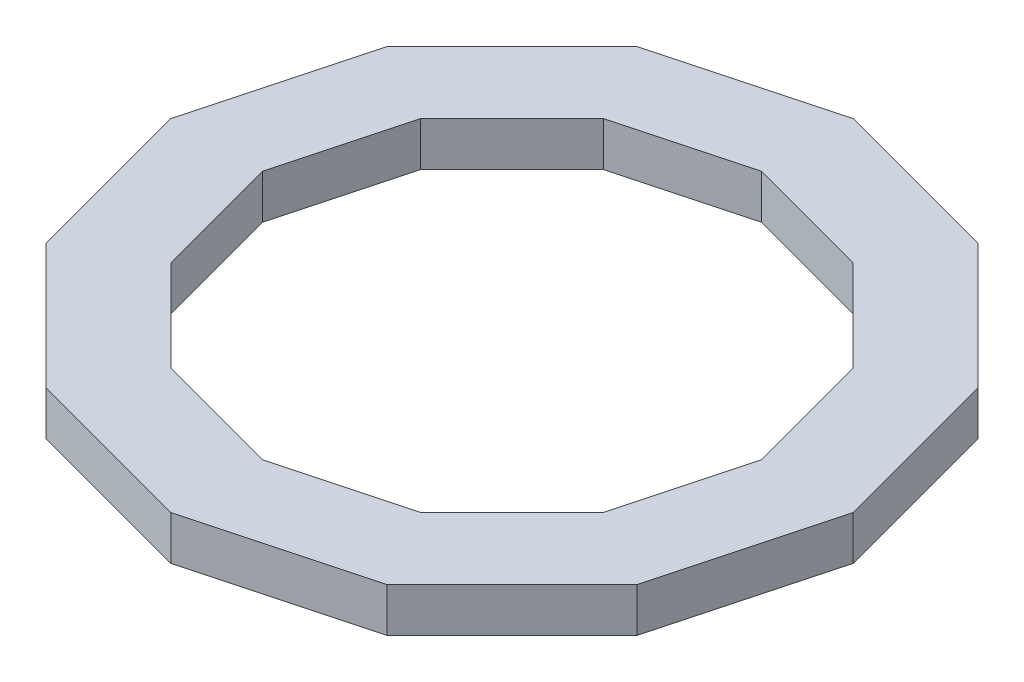
ISO-10303-21;
HEADER;
FILE_DESCRIPTION(('STEP AP214'),'2;1');
FILE_NAME('part.step','',(''),(''),'','','');
FILE_SCHEMA(('AUTOMOTIVE_DESIGN { 1 0 10303 214 1 1 1 1 }'));
ENDSEC;
DATA;
#1=APPLICATION_CONTEXT('core data for automotive mechanical design processes');
#2=APPLICATION_PROTOCOL_DEFINITION('international standard','automotive_design',2000,#1);
#3=PRODUCT_CONTEXT('',#1,'mechanical');
#4=PRODUCT('Part','Part','',(#3));
#5=PRODUCT_RELATED_PRODUCT_CATEGORY('part','',(#4));
#6=PRODUCT_DEFINITION_FORMATION('','',#4);
#7=PRODUCT_DEFINITION_CONTEXT('part definition',#1,'design');
#8=PRODUCT_DEFINITION('design','',#6,#7);
#9=PRODUCT_DEFINITION_SHAPE('','',#8);
#10=(LENGTH_UNIT() NAMED_UNIT(*) SI_UNIT(.MILLI.,.METRE.));
#11=(NAMED_UNIT(*) PLANE_ANGLE_UNIT() SI_UNIT($,.RADIAN.));
#12=(NAMED_UNIT(*) SI_UNIT($,.STERADIAN.) SOLID_ANGLE_UNIT());
#13=UNCERTAINTY_MEASURE_WITH_UNIT(LENGTH_MEASURE(1.E-05),#10,'distance_accuracy_value','');
#14=(GEOMETRIC_REPRESENTATION_CONTEXT(3) GLOBAL_UNCERTAINTY_ASSIGNED_CONTEXT((#13)) GLOBAL_UNIT_ASSIGNED_CONTEXT((#10,
#11,#12)) REPRESENTATION_CONTEXT('',''));
#15=CARTESIAN_POINT('',(0.,0.,0.));
#16=DIRECTION('',(0.,0.,1.));
#17=DIRECTION('',(1.,0.,0.));
#18=AXIS2_PLACEMENT_3D('',#15,#16,#17);
#19=CARTESIAN_POINT('',(0.,19.05,0.));
#20=DIRECTION('',(0.,1.,0.));
#21=DIRECTION('',(0.,0.,1.));
#22=AXIS2_PLACEMENT_3D('',#19,#20,#21);
#23=PLANE('',#22);
#24=DIRECTION('',(-0.258819045102521,0.,0.965925826289068));
#25=VECTOR('',#24,1.);
#26=CARTESIAN_POINT('',(-127.485084689642,19.05,-73.603547963227));
#27=LINE('',#26,#25);
#28=CARTESIAN_POINT('',(-127.485084689642,19.05,-73.603547963227));
#29=VERTEX_POINT('',#28);
#30=CARTESIAN_POINT('',(-147.207095926454,19.05,0.));
#31=VERTEX_POINT('',#30);
#32=EDGE_CURVE('E287',#29,#31,#27,.T.);
#33=ORIENTED_EDGE('',*,*,#32,.T.);
#34=DIRECTION('',(0.258819045102522,0.,0.965925826289068));
#35=VECTOR('',#34,1.);
#36=CARTESIAN_POINT('',(-147.207095926454,19.05,0.));
#37=LINE('',#36,#35);
#38=CARTESIAN_POINT('',(-127.485084689642,19.05,73.603547963227));
#39=VERTEX_POINT('',#38);
#40=EDGE_CURVE('E290',#31,#39,#37,.T.);
#41=ORIENTED_EDGE('',*,*,#40,.T.);
#42=DIRECTION('',(0.707106781186547,0.,0.707106781186548));
#43=VECTOR('',#42,1.);
#44=CARTESIAN_POINT('',(-127.485084689642,19.05,73.603547963227));
#45=LINE('',#44,#43);
#46=CARTESIAN_POINT('',(-73.603547963227,19.05,127.485084689642));
#47=VERTEX_POINT('',#46);
#48=EDGE_CURVE('E293',#39,#47,#45,.T.);
#49=ORIENTED_EDGE('',*,*,#48,.T.);
#50=DIRECTION('',(0.965925826289069,0.,0.25881904510252));
#51=VECTOR('',#50,1.);
#52=CARTESIAN_POINT('',(-73.603547963227,19.05,127.485084689642));
#53=LINE('',#52,#51);
#54=CARTESIAN_POINT('',(0.,19.05,147.207095926454));
#55=VERTEX_POINT('',#54);
#56=EDGE_CURVE('E295',#47,#55,#53,.T.);
#57=ORIENTED_EDGE('',*,*,#56,.T.);
#58=DIRECTION('',(0.965925826289068,0.,-0.258819045102521));
#59=VECTOR('',#58,1.);
#60=CARTESIAN_POINT('',(0.,19.05,147.207095926454));
#61=LINE('',#60,#59);
#62=CARTESIAN_POINT('',(73.603547963227,19.05,127.485084689642));
#63=VERTEX_POINT('',#62);
#64=EDGE_CURVE('E297',#55,#63,#61,.T.);
#65=ORIENTED_EDGE('',*,*,#64,.T.);
#66=DIRECTION('',(0.707106781186547,0.,-0.707106781186548));
#67=VECTOR('',#66,1.);
#68=CARTESIAN_POINT('',(73.603547963227,19.05,127.485084689642));
#69=LINE('',#68,#67);
#70=CARTESIAN_POINT('',(127.485084689642,19.05,73.603547963227));
#71=VERTEX_POINT('',#70);
#72=EDGE_CURVE('E299',#63,#71,#69,.T.);
#73=ORIENTED_EDGE('',*,*,#72,.T.);
#74=DIRECTION('',(0.25881904510252,0.,-0.965925826289068));
#75=VECTOR('',#74,1.);
#76=CARTESIAN_POINT('',(127.485084689642,19.05,73.603547963227));
#77=LINE('',#76,#75);
#78=CARTESIAN_POINT('',(147.207095926454,19.05,0.));
#79=VERTEX_POINT('',#78);
#80=EDGE_CURVE('E301',#71,#79,#77,.T.);
#81=ORIENTED_EDGE('',*,*,#80,.T.);
#82=DIRECTION('',(-0.258819045102521,0.,-0.965925826289068));
#83=VECTOR('',#82,1.);
#84=CARTESIAN_POINT('',(147.207095926454,19.05,0.));
#85=LINE('',#84,#83);
#86=CARTESIAN_POINT('',(127.485084689642,19.05,-73.603547963227));
#87=VERTEX_POINT('',#86);
#88=EDGE_CURVE('E303',#79,#87,#85,.T.);
#89=ORIENTED_EDGE('',*,*,#88,.T.);
#90=DIRECTION('',(-0.707106781186548,0.,-0.707106781186548));
#91=VECTOR('',#90,1.);
#92=CARTESIAN_POINT('',(127.485084689642,19.05,-73.603547963227));
#93=LINE('',#92,#91);
#94=CARTESIAN_POINT('',(73.6035479632268,19.05,-127.485084689642));
#95=VERTEX_POINT('',#94);
#96=EDGE_CURVE('E305',#87,#95,#93,.T.);
#97=ORIENTED_EDGE('',*,*,#96,.T.);
#98=DIRECTION('',(-0.965925826289068,0.,-0.25881904510252));
#99=VECTOR('',#98,1.);
#100=CARTESIAN_POINT('',(73.6035479632268,19.05,-127.485084689642));
#101=LINE('',#100,#99);
#102=CARTESIAN_POINT('',(0.,19.05,-147.207095926454));
#103=VERTEX_POINT('',#102);
#104=EDGE_CURVE('E307',#95,#103,#101,.T.);
#105=ORIENTED_EDGE('',*,*,#104,.T.);
#106=DIRECTION('',(-0.965925826289068,0.,0.258819045102521));
#107=VECTOR('',#106,1.);
#108=CARTESIAN_POINT('',(0.,19.05,-147.207095926454));
#109=LINE('',#108,#107);
#110=CARTESIAN_POINT('',(-73.603547963227,19.05,-127.485084689642));
#111=VERTEX_POINT('',#110);
#112=EDGE_CURVE('E309',#103,#111,#109,.T.);
#113=ORIENTED_EDGE('',*,*,#112,.T.);
#114=DIRECTION('',(-0.707106781186548,0.,0.707106781186548));
#115=VECTOR('',#114,1.);
#116=CARTESIAN_POINT('',(-73.603547963227,19.05,-127.485084689642));
#117=LINE('',#116,#115);
#118=EDGE_CURVE('E311',#111,#29,#117,.T.);
#119=ORIENTED_EDGE('',*,*,#118,.T.);
#120=EDGE_LOOP('',(#33,#41,#49,#57,#65,#73,#81,#89,#97,#105,#113,#119));
#121=FACE_BOUND('',#120,.T.);
#122=DIRECTION('',(0.258819045102521,0.,0.965925826289068));
#123=VECTOR('',#122,1.);
#124=CARTESIAN_POINT('',(-107.76307345283,19.05,0.));
#125=LINE('',#124,#123);
#126=CARTESIAN_POINT('',(-107.76307345283,19.05,0.));
#127=VERTEX_POINT('',#126);
#128=CARTESIAN_POINT('',(-93.325559200039,19.05,53.8815367264149));
#129=VERTEX_POINT('',#128);
#130=EDGE_CURVE('E202',#127,#129,#125,.T.);
#131=ORIENTED_EDGE('',*,*,#130,.F.);
#132=DIRECTION('',(-0.258819045102521,0.,0.965925826289068));
#133=VECTOR('',#132,1.);
#134=CARTESIAN_POINT('',(-93.325559200039,19.05,-53.8815367264149));
#135=LINE('',#134,#133);
#136=CARTESIAN_POINT('',(-93.325559200039,19.05,-53.8815367264149));
#137=VERTEX_POINT('',#136);
#138=EDGE_CURVE('E194',#137,#127,#135,.T.);
#139=ORIENTED_EDGE('',*,*,#138,.F.);
#140=DIRECTION('',(-0.707106781186548,0.,0.707106781186548));
#141=VECTOR('',#140,1.);
#142=CARTESIAN_POINT('',(-53.8815367264149,19.05,-93.325559200039));
#143=LINE('',#142,#141);
#144=CARTESIAN_POINT('',(-53.8815367264149,19.05,-93.325559200039));
#145=VERTEX_POINT('',#144);
#146=EDGE_CURVE('E235',#145,#137,#143,.T.);
#147=ORIENTED_EDGE('',*,*,#146,.F.);
#148=DIRECTION('',(-0.965925826289068,0.,0.258819045102521));
#149=VECTOR('',#148,1.);
#150=CARTESIAN_POINT('',(0.,19.05,-107.76307345283));
#151=LINE('',#150,#149);
#152=CARTESIAN_POINT('',(0.,19.05,-107.76307345283));
#153=VERTEX_POINT('',#152);
#154=EDGE_CURVE('E233',#153,#145,#151,.T.);
#155=ORIENTED_EDGE('',*,*,#154,.F.);
#156=DIRECTION('',(-0.965925826289068,0.,-0.258819045102521));
#157=VECTOR('',#156,1.);
#158=CARTESIAN_POINT('',(53.8815367264149,19.05,-93.325559200039));
#159=LINE('',#158,#157);
#160=CARTESIAN_POINT('',(53.8815367264149,19.05,-93.325559200039));
#161=VERTEX_POINT('',#160);
#162=EDGE_CURVE('E231',#161,#153,#159,.T.);
#163=ORIENTED_EDGE('',*,*,#162,.F.);
#164=DIRECTION('',(-0.707106781186547,0.,-0.707106781186548));
#165=VECTOR('',#164,1.);
#166=CARTESIAN_POINT('',(93.325559200039,19.05,-53.8815367264149));
#167=LINE('',#166,#165);
#168=CARTESIAN_POINT('',(93.325559200039,19.05,-53.8815367264149));
#169=VERTEX_POINT('',#168);
#170=EDGE_CURVE('E229',#169,#161,#167,.T.);
#171=ORIENTED_EDGE('',*,*,#170,.F.);
#172=DIRECTION('',(-0.258819045102521,0.,-0.965925826289068));
#173=VECTOR('',#172,1.);
#174=CARTESIAN_POINT('',(107.76307345283,19.05,0.));
#175=LINE('',#174,#173);
#176=CARTESIAN_POINT('',(107.76307345283,19.05,0.));
#177=VERTEX_POINT('',#176);
#178=EDGE_CURVE('E227',#177,#169,#175,.T.);
#179=ORIENTED_EDGE('',*,*,#178,.F.);
#180=DIRECTION('',(0.258819045102521,0.,-0.965925826289068));
#181=VECTOR('',#180,1.);
#182=CARTESIAN_POINT('',(93.325559200039,19.05,53.8815367264149));
#183=LINE('',#182,#181);
#184=CARTESIAN_POINT('',(93.325559200039,19.05,53.8815367264149));
#185=VERTEX_POINT('',#184);
#186=EDGE_CURVE('E225',#185,#177,#183,.T.);
#187=ORIENTED_EDGE('',*,*,#186,.F.);
#188=DIRECTION('',(0.707106781186547,0.,-0.707106781186548));
#189=VECTOR('',#188,1.);
#190=CARTESIAN_POINT('',(53.8815367264149,19.05,93.325559200039));
#191=LINE('',#190,#189);
#192=CARTESIAN_POINT('',(53.8815367264149,19.05,93.325559200039));
#193=VERTEX_POINT('',#192);
#194=EDGE_CURVE('E223',#193,#185,#191,.T.);
#195=ORIENTED_EDGE('',*,*,#194,.F.);
#196=DIRECTION('',(0.965925826289068,0.,-0.258819045102521));
#197=VECTOR('',#196,1.);
#198=CARTESIAN_POINT('',(0.,19.05,107.76307345283));
#199=LINE('',#198,#197);
#200=CARTESIAN_POINT('',(0.,19.05,107.76307345283));
#201=VERTEX_POINT('',#200);
#202=EDGE_CURVE('E221',#201,#193,#199,.T.);
#203=ORIENTED_EDGE('',*,*,#202,.F.);
#204=DIRECTION('',(0.965925826289068,0.,0.258819045102521));
#205=VECTOR('',#204,1.);
#206=CARTESIAN_POINT('',(-53.8815367264149,19.05,93.325559200039));
#207=LINE('',#206,#205);
#208=CARTESIAN_POINT('',(-53.8815367264149,19.05,93.325559200039));
#209=VERTEX_POINT('',#208);
#210=EDGE_CURVE('E217',#209,#201,#207,.T.);
#211=ORIENTED_EDGE('',*,*,#210,.F.);
#212=DIRECTION('',(0.707106781186548,0.,0.707106781186547));
#213=VECTOR('',#212,1.);
#214=CARTESIAN_POINT('',(-93.325559200039,19.05,53.8815367264149));
#215=LINE('',#214,#213);
#216=EDGE_CURVE('E215',#129,#209,#215,.T.);
#217=ORIENTED_EDGE('',*,*,#216,.F.);
#218=EDGE_LOOP('',(#131,#139,#147,#155,#163,#171,#179,#187,#195,#203,#211,#217));
#219=FACE_BOUND('',#218,.T.);
#220=ADVANCED_FACE('F33',(#121,#219),#23,.T.);
#221=CARTESIAN_POINT('',(0.,0.,0.));
#222=DIRECTION('',(0.,1.,0.));
#223=DIRECTION('',(0.,0.,1.));
#224=AXIS2_PLACEMENT_3D('',#221,#222,#223);
#225=PLANE('',#224);
#226=DIRECTION('',(-0.258819045102521,0.,0.965925826289068));
#227=VECTOR('',#226,1.);
#228=CARTESIAN_POINT('',(-127.485084689642,0.,-73.603547963227));
#229=LINE('',#228,#227);
#230=CARTESIAN_POINT('',(-127.485084689642,0.,-73.603547963227));
#231=VERTEX_POINT('',#230);
#232=CARTESIAN_POINT('',(-147.207095926454,0.,0.));
#233=VERTEX_POINT('',#232);
#234=EDGE_CURVE('E210',#231,#233,#229,.T.);
#235=ORIENTED_EDGE('',*,*,#234,.F.);
#236=DIRECTION('',(-0.707106781186548,0.,0.707106781186548));
#237=VECTOR('',#236,1.);
#238=CARTESIAN_POINT('',(-73.603547963227,0.,-127.485084689642));
#239=LINE('',#238,#237);
#240=CARTESIAN_POINT('',(-73.603547963227,0.,-127.485084689642));
#241=VERTEX_POINT('',#240);
#242=EDGE_CURVE('E291',#241,#231,#239,.T.);
#243=ORIENTED_EDGE('',*,*,#242,.F.);
#244=DIRECTION('',(-0.965925826289068,0.,0.258819045102521));
#245=VECTOR('',#244,1.);
#246=CARTESIAN_POINT('',(0.,0.,-147.207095926454));
#247=LINE('',#246,#245);
#248=CARTESIAN_POINT('',(0.,0.,-147.207095926454));
#249=VERTEX_POINT('',#248);
#250=EDGE_CURVE('E334',#249,#241,#247,.T.);
#251=ORIENTED_EDGE('',*,*,#250,.F.);
#252=DIRECTION('',(-0.965925826289068,0.,-0.25881904510252));
#253=VECTOR('',#252,1.);
#254=CARTESIAN_POINT('',(73.6035479632268,0.,-127.485084689642));
#255=LINE('',#254,#253);
#256=CARTESIAN_POINT('',(73.6035479632268,0.,-127.485084689642));
#257=VERTEX_POINT('',#256);
#258=EDGE_CURVE('E332',#257,#249,#255,.T.);
#259=ORIENTED_EDGE('',*,*,#258,.F.);
#260=DIRECTION('',(-0.707106781186548,0.,-0.707106781186548));
#261=VECTOR('',#260,1.);
#262=CARTESIAN_POINT('',(127.485084689642,0.,-73.603547963227));
#263=LINE('',#262,#261);
#264=CARTESIAN_POINT('',(127.485084689642,0.,-73.603547963227));
#265=VERTEX_POINT('',#264);
#266=EDGE_CURVE('E330',#265,#257,#263,.T.);
#267=ORIENTED_EDGE('',*,*,#266,.F.);
#268=DIRECTION('',(-0.258819045102521,0.,-0.965925826289068));
#269=VECTOR('',#268,1.);
#270=CARTESIAN_POINT('',(147.207095926454,0.,0.));
#271=LINE('',#270,#269);
#272=CARTESIAN_POINT('',(147.207095926454,0.,0.));
#273=VERTEX_POINT('',#272);
#274=EDGE_CURVE('E328',#273,#265,#271,.T.);
#275=ORIENTED_EDGE('',*,*,#274,.F.);
#276=DIRECTION('',(0.25881904510252,0.,-0.965925826289068));
#277=VECTOR('',#276,1.);
#278=CARTESIAN_POINT('',(127.485084689642,0.,73.603547963227));
#279=LINE('',#278,#277);
#280=CARTESIAN_POINT('',(127.485084689642,0.,73.603547963227));
#281=VERTEX_POINT('',#280);
#282=EDGE_CURVE('E326',#281,#273,#279,.T.);
#283=ORIENTED_EDGE('',*,*,#282,.F.);
#284=DIRECTION('',(0.707106781186547,0.,-0.707106781186548));
#285=VECTOR('',#284,1.);
#286=CARTESIAN_POINT('',(73.603547963227,0.,127.485084689642));
#287=LINE('',#286,#285);
#288=CARTESIAN_POINT('',(73.603547963227,0.,127.485084689642));
#289=VERTEX_POINT('',#288);
#290=EDGE_CURVE('E324',#289,#281,#287,.T.);
#291=ORIENTED_EDGE('',*,*,#290,.F.);
#292=DIRECTION('',(0.965925826289068,0.,-0.258819045102521));
#293=VECTOR('',#292,1.);
#294=CARTESIAN_POINT('',(0.,0.,147.207095926454));
#295=LINE('',#294,#293);
#296=CARTESIAN_POINT('',(0.,0.,147.207095926454));
#297=VERTEX_POINT('',#296);
#298=EDGE_CURVE('E322',#297,#289,#295,.T.);
#299=ORIENTED_EDGE('',*,*,#298,.F.);
#300=DIRECTION('',(0.965925826289069,0.,0.25881904510252));
#301=VECTOR('',#300,1.);
#302=CARTESIAN_POINT('',(-73.603547963227,0.,127.485084689642));
#303=LINE('',#302,#301);
#304=CARTESIAN_POINT('',(-73.603547963227,0.,127.485084689642));
#305=VERTEX_POINT('',#304);
#306=EDGE_CURVE('E320',#305,#297,#303,.T.);
#307=ORIENTED_EDGE('',*,*,#306,.F.);
#308=DIRECTION('',(0.707106781186547,0.,0.707106781186548));
#309=VECTOR('',#308,1.);
#310=CARTESIAN_POINT('',(-127.485084689642,0.,73.603547963227));
#311=LINE('',#310,#309);
#312=CARTESIAN_POINT('',(-127.485084689642,0.,73.603547963227));
#313=VERTEX_POINT('',#312);
#314=EDGE_CURVE('E318',#313,#305,#311,.T.);
#315=ORIENTED_EDGE('',*,*,#314,.F.);
#316=DIRECTION('',(0.258819045102522,0.,0.965925826289068));
#317=VECTOR('',#316,1.);
#318=CARTESIAN_POINT('',(-147.207095926454,0.,0.));
#319=LINE('',#318,#317);
#320=EDGE_CURVE('E316',#233,#313,#319,.T.);
#321=ORIENTED_EDGE('',*,*,#320,.F.);
#322=EDGE_LOOP('',(#235,#243,#251,#259,#267,#275,#283,#291,#299,#307,#315,#321));
#323=FACE_BOUND('',#322,.T.);
#324=DIRECTION('',(-0.258819045102521,0.,0.965925826289068));
#325=VECTOR('',#324,1.);
#326=CARTESIAN_POINT('',(-93.325559200039,0.,-53.8815367264149));
#327=LINE('',#326,#325);
#328=CARTESIAN_POINT('',(-93.325559200039,0.,-53.8815367264149));
#329=VERTEX_POINT('',#328);
#330=CARTESIAN_POINT('',(-107.76307345283,0.,0.));
#331=VERTEX_POINT('',#330);
#332=EDGE_CURVE('E56',#329,#331,#327,.T.);
#333=ORIENTED_EDGE('',*,*,#332,.T.);
#334=DIRECTION('',(0.258819045102521,0.,0.965925826289068));
#335=VECTOR('',#334,1.);
#336=CARTESIAN_POINT('',(-107.76307345283,0.,0.));
#337=LINE('',#336,#335);
#338=CARTESIAN_POINT('',(-93.325559200039,0.,53.8815367264149));
#339=VERTEX_POINT('',#338);
#340=EDGE_CURVE('E209',#331,#339,#337,.T.);
#341=ORIENTED_EDGE('',*,*,#340,.T.);
#342=DIRECTION('',(0.707106781186548,0.,0.707106781186547));
#343=VECTOR('',#342,1.);
#344=CARTESIAN_POINT('',(-93.325559200039,0.,53.8815367264149));
#345=LINE('',#344,#343);
#346=CARTESIAN_POINT('',(-53.8815367264149,0.,93.325559200039));
#347=VERTEX_POINT('',#346);
#348=EDGE_CURVE('E239',#339,#347,#345,.T.);
#349=ORIENTED_EDGE('',*,*,#348,.T.);
#350=DIRECTION('',(0.965925826289068,0.,0.258819045102521));
#351=VECTOR('',#350,1.);
#352=CARTESIAN_POINT('',(-53.8815367264149,0.,93.325559200039));
#353=LINE('',#352,#351);
#354=CARTESIAN_POINT('',(0.,0.,107.76307345283));
#355=VERTEX_POINT('',#354);
#356=EDGE_CURVE('E242',#347,#355,#353,.T.);
#357=ORIENTED_EDGE('',*,*,#356,.T.);
#358=DIRECTION('',(0.965925826289068,0.,-0.258819045102521));
#359=VECTOR('',#358,1.);
#360=CARTESIAN_POINT('',(0.,0.,107.76307345283));
#361=LINE('',#360,#359);
#362=CARTESIAN_POINT('',(53.8815367264149,0.,93.325559200039));
#363=VERTEX_POINT('',#362);
#364=EDGE_CURVE('E245',#355,#363,#361,.T.);
#365=ORIENTED_EDGE('',*,*,#364,.T.);
#366=DIRECTION('',(0.707106781186547,0.,-0.707106781186548));
#367=VECTOR('',#366,1.);
#368=CARTESIAN_POINT('',(53.8815367264149,0.,93.325559200039));
#369=LINE('',#368,#367);
#370=CARTESIAN_POINT('',(93.325559200039,0.,53.8815367264149));
#371=VERTEX_POINT('',#370);
#372=EDGE_CURVE('E248',#363,#371,#369,.T.);
#373=ORIENTED_EDGE('',*,*,#372,.T.);
#374=DIRECTION('',(0.258819045102521,0.,-0.965925826289068));
#375=VECTOR('',#374,1.);
#376=CARTESIAN_POINT('',(93.325559200039,0.,53.8815367264149));
#377=LINE('',#376,#375);
#378=CARTESIAN_POINT('',(107.76307345283,0.,0.));
#379=VERTEX_POINT('',#378);
#380=EDGE_CURVE('E251',#371,#379,#377,.T.);
#381=ORIENTED_EDGE('',*,*,#380,.T.);
#382=DIRECTION('',(-0.258819045102521,0.,-0.965925826289068));
#383=VECTOR('',#382,1.);
#384=CARTESIAN_POINT('',(107.76307345283,0.,0.));
#385=LINE('',#384,#383);
#386=CARTESIAN_POINT('',(93.325559200039,0.,-53.8815367264149));
#387=VERTEX_POINT('',#386);
#388=EDGE_CURVE('E254',#379,#387,#385,.T.);
#389=ORIENTED_EDGE('',*,*,#388,.T.);
#390=DIRECTION('',(-0.707106781186547,0.,-0.707106781186548));
#391=VECTOR('',#390,1.);
#392=CARTESIAN_POINT('',(93.325559200039,0.,-53.8815367264149));
#393=LINE('',#392,#391);
#394=CARTESIAN_POINT('',(53.8815367264149,0.,-93.325559200039));
#395=VERTEX_POINT('',#394);
#396=EDGE_CURVE('E257',#387,#395,#393,.T.);
#397=ORIENTED_EDGE('',*,*,#396,.T.);
#398=DIRECTION('',(-0.965925826289068,0.,-0.258819045102521));
#399=VECTOR('',#398,1.);
#400=CARTESIAN_POINT('',(53.8815367264149,0.,-93.325559200039));
#401=LINE('',#400,#399);
#402=CARTESIAN_POINT('',(0.,0.,-107.76307345283));
#403=VERTEX_POINT('',#402);
#404=EDGE_CURVE('E260',#395,#403,#401,.T.);
#405=ORIENTED_EDGE('',*,*,#404,.T.);
#406=DIRECTION('',(-0.965925826289068,0.,0.258819045102521));
#407=VECTOR('',#406,1.);
#408=CARTESIAN_POINT('',(0.,0.,-107.76307345283));
#409=LINE('',#408,#407);
#410=CARTESIAN_POINT('',(-53.8815367264149,0.,-93.325559200039));
#411=VERTEX_POINT('',#410);
#412=EDGE_CURVE('E263',#403,#411,#409,.T.);
#413=ORIENTED_EDGE('',*,*,#412,.T.);
#414=DIRECTION('',(-0.707106781186548,0.,0.707106781186548));
#415=VECTOR('',#414,1.);
#416=CARTESIAN_POINT('',(-53.8815367264149,0.,-93.325559200039));
#417=LINE('',#416,#415);
#418=EDGE_CURVE('E203',#411,#329,#417,.T.);
#419=ORIENTED_EDGE('',*,*,#418,.T.);
#420=EDGE_LOOP('',(#333,#341,#349,#357,#365,#373,#381,#389,#397,#405,#413,#419));
#421=FACE_BOUND('',#420,.T.);
#422=ADVANCED_FACE('F376',(#323,#421),#225,.F.);
#423=CARTESIAN_POINT('',(-127.485084689642,19.05,-73.603547963227));
#424=DIRECTION('',(0.965925826289068,0.,0.258819045102521));
#425=DIRECTION('',(0.258819045102521,0.,-0.965925826289068));
#426=AXIS2_PLACEMENT_3D('',#423,#424,#425);
#427=PLANE('',#426);
#428=ORIENTED_EDGE('',*,*,#234,.T.);
#429=DIRECTION('',(0.,-1.,0.));
#430=VECTOR('',#429,1.);
#431=CARTESIAN_POINT('',(-147.207095926454,19.05,0.));
#432=LINE('',#431,#430);
#433=EDGE_CURVE('E11',#31,#233,#432,.T.);
#434=ORIENTED_EDGE('',*,*,#433,.F.);
#435=ORIENTED_EDGE('',*,*,#32,.F.);
#436=DIRECTION('',(0.,-1.,0.));
#437=VECTOR('',#436,1.);
#438=CARTESIAN_POINT('',(-127.485084689642,19.05,-73.603547963227));
#439=LINE('',#438,#437);
#440=EDGE_CURVE('E313',#29,#231,#439,.T.);
#441=ORIENTED_EDGE('',*,*,#440,.T.);
#442=EDGE_LOOP('',(#428,#434,#435,#441));
#443=FACE_BOUND('',#442,.T.);
#444=ADVANCED_FACE('F35',(#443),#427,.F.);
#445=CARTESIAN_POINT('',(-147.207095926454,19.05,0.));
#446=DIRECTION('',(0.965925826289068,0.,-0.258819045102521));
#447=DIRECTION('',(-0.258819045102521,0.,-0.965925826289068));
#448=AXIS2_PLACEMENT_3D('',#445,#446,#447);
#449=PLANE('',#448);
#450=ORIENTED_EDGE('',*,*,#320,.T.);
#451=DIRECTION('',(0.,-1.,0.));
#452=VECTOR('',#451,1.);
#453=CARTESIAN_POINT('',(-127.485084689642,19.05,73.603547963227));
#454=LINE('',#453,#452);
#455=EDGE_CURVE('E41',#39,#313,#454,.T.);
#456=ORIENTED_EDGE('',*,*,#455,.F.);
#457=ORIENTED_EDGE('',*,*,#40,.F.);
#458=ORIENTED_EDGE('',*,*,#433,.T.);
#459=EDGE_LOOP('',(#450,#456,#457,#458));
#460=FACE_BOUND('',#459,.T.);
#461=ADVANCED_FACE('F393',(#460),#449,.F.);
#462=CARTESIAN_POINT('',(-127.485084689642,19.05,73.603547963227));
#463=DIRECTION('',(0.707106781186548,0.,-0.707106781186547));
#464=DIRECTION('',(-0.707106781186547,0.,-0.707106781186548));
#465=AXIS2_PLACEMENT_3D('',#462,#463,#464);
#466=PLANE('',#465);
#467=ORIENTED_EDGE('',*,*,#314,.T.);
#468=DIRECTION('',(0.,-1.,0.));
#469=VECTOR('',#468,1.);
#470=CARTESIAN_POINT('',(-73.603547963227,19.05,127.485084689642));
#471=LINE('',#470,#469);
#472=EDGE_CURVE('E363',#47,#305,#471,.T.);
#473=ORIENTED_EDGE('',*,*,#472,.F.);
#474=ORIENTED_EDGE('',*,*,#48,.F.);
#475=ORIENTED_EDGE('',*,*,#455,.T.);
#476=EDGE_LOOP('',(#467,#473,#474,#475));
#477=FACE_BOUND('',#476,.T.);
#478=ADVANCED_FACE('F370',(#477),#466,.F.);
#479=CARTESIAN_POINT('',(-73.603547963227,19.05,127.485084689642));
#480=DIRECTION('',(0.25881904510252,0.,-0.965925826289068));
#481=DIRECTION('',(-0.965925826289068,0.,-0.25881904510252));
#482=AXIS2_PLACEMENT_3D('',#479,#480,#481);
#483=PLANE('',#482);
#484=ORIENTED_EDGE('',*,*,#306,.T.);
#485=DIRECTION('',(0.,-1.,0.));
#486=VECTOR('',#485,1.);
#487=CARTESIAN_POINT('',(0.,19.05,147.207095926454));
#488=LINE('',#487,#486);
#489=EDGE_CURVE('E360',#55,#297,#488,.T.);
#490=ORIENTED_EDGE('',*,*,#489,.F.);
#491=ORIENTED_EDGE('',*,*,#56,.F.);
#492=ORIENTED_EDGE('',*,*,#472,.T.);
#493=EDGE_LOOP('',(#484,#490,#491,#492));
#494=FACE_BOUND('',#493,.T.);
#495=ADVANCED_FACE('F382',(#494),#483,.F.);
#496=CARTESIAN_POINT('',(0.,19.05,147.207095926454));
#497=DIRECTION('',(-0.258819045102521,0.,-0.965925826289068));
#498=DIRECTION('',(-0.965925826289068,0.,0.258819045102521));
#499=AXIS2_PLACEMENT_3D('',#496,#497,#498);
#500=PLANE('',#499);
#501=ORIENTED_EDGE('',*,*,#298,.T.);
#502=DIRECTION('',(0.,-1.,0.));
#503=VECTOR('',#502,1.);
#504=CARTESIAN_POINT('',(73.603547963227,19.05,127.485084689642));
#505=LINE('',#504,#503);
#506=EDGE_CURVE('E357',#63,#289,#505,.T.);
#507=ORIENTED_EDGE('',*,*,#506,.F.);
#508=ORIENTED_EDGE('',*,*,#64,.F.);
#509=ORIENTED_EDGE('',*,*,#489,.T.);
#510=EDGE_LOOP('',(#501,#507,#508,#509));
#511=FACE_BOUND('',#510,.T.);
#512=ADVANCED_FACE('F386',(#511),#500,.F.);
#513=CARTESIAN_POINT('',(73.603547963227,19.05,127.485084689642));
#514=DIRECTION('',(-0.707106781186548,0.,-0.707106781186547));
#515=DIRECTION('',(-0.707106781186547,0.,0.707106781186548));
#516=AXIS2_PLACEMENT_3D('',#513,#514,#515);
#517=PLANE('',#516);
#518=ORIENTED_EDGE('',*,*,#290,.T.);
#519=DIRECTION('',(0.,-1.,0.));
#520=VECTOR('',#519,1.);
#521=CARTESIAN_POINT('',(127.485084689642,19.05,73.603547963227));
#522=LINE('',#521,#520);
#523=EDGE_CURVE('E354',#71,#281,#522,.T.);
#524=ORIENTED_EDGE('',*,*,#523,.F.);
#525=ORIENTED_EDGE('',*,*,#72,.F.);
#526=ORIENTED_EDGE('',*,*,#506,.T.);
#527=EDGE_LOOP('',(#518,#524,#525,#526));
#528=FACE_BOUND('',#527,.T.);
#529=ADVANCED_FACE('F426',(#528),#517,.F.);
#530=CARTESIAN_POINT('',(127.485084689642,19.05,73.603547963227));
#531=DIRECTION('',(-0.965925826289068,0.,-0.25881904510252));
#532=DIRECTION('',(-0.258819045102521,0.,0.965925826289069));
#533=AXIS2_PLACEMENT_3D('',#530,#531,#532);
#534=PLANE('',#533);
#535=ORIENTED_EDGE('',*,*,#282,.T.);
#536=DIRECTION('',(0.,-1.,0.));
#537=VECTOR('',#536,1.);
#538=CARTESIAN_POINT('',(147.207095926454,19.05,0.));
#539=LINE('',#538,#537);
#540=EDGE_CURVE('E351',#79,#273,#539,.T.);
#541=ORIENTED_EDGE('',*,*,#540,.F.);
#542=ORIENTED_EDGE('',*,*,#80,.F.);
#543=ORIENTED_EDGE('',*,*,#523,.T.);
#544=EDGE_LOOP('',(#535,#541,#542,#543));
#545=FACE_BOUND('',#544,.T.);
#546=ADVANCED_FACE('F424',(#545),#534,.F.);
#547=CARTESIAN_POINT('',(147.207095926454,19.05,0.));
#548=DIRECTION('',(-0.965925826289068,0.,0.258819045102521));
#549=DIRECTION('',(0.258819045102521,0.,0.965925826289068));
#550=AXIS2_PLACEMENT_3D('',#547,#548,#549);
#551=PLANE('',#550);
#552=ORIENTED_EDGE('',*,*,#274,.T.);
#553=DIRECTION('',(0.,-1.,0.));
#554=VECTOR('',#553,1.);
#555=CARTESIAN_POINT('',(127.485084689642,19.05,-73.603547963227));
#556=LINE('',#555,#554);
#557=EDGE_CURVE('E348',#87,#265,#556,.T.);
#558=ORIENTED_EDGE('',*,*,#557,.F.);
#559=ORIENTED_EDGE('',*,*,#88,.F.);
#560=ORIENTED_EDGE('',*,*,#540,.T.);
#561=EDGE_LOOP('',(#552,#558,#559,#560));
#562=FACE_BOUND('',#561,.T.);
#563=ADVANCED_FACE('F420',(#562),#551,.F.);
#564=CARTESIAN_POINT('',(127.485084689642,19.05,-73.603547963227));
#565=DIRECTION('',(-0.707106781186548,0.,0.707106781186548));
#566=DIRECTION('',(0.707106781186548,0.,0.707106781186548));
#567=AXIS2_PLACEMENT_3D('',#564,#565,#566);
#568=PLANE('',#567);
#569=ORIENTED_EDGE('',*,*,#266,.T.);
#570=DIRECTION('',(0.,-1.,0.));
#571=VECTOR('',#570,1.);
#572=CARTESIAN_POINT('',(73.6035479632268,19.05,-127.485084689642));
#573=LINE('',#572,#571);
#574=EDGE_CURVE('E345',#95,#257,#573,.T.);
#575=ORIENTED_EDGE('',*,*,#574,.F.);
#576=ORIENTED_EDGE('',*,*,#96,.F.);
#577=ORIENTED_EDGE('',*,*,#557,.T.);
#578=EDGE_LOOP('',(#569,#575,#576,#577));
#579=FACE_BOUND('',#578,.T.);
#580=ADVANCED_FACE('F415',(#579),#568,.F.);
#581=CARTESIAN_POINT('',(73.6035479632268,19.05,-127.485084689642));
#582=DIRECTION('',(-0.25881904510252,0.,0.965925826289069));
#583=DIRECTION('',(0.965925826289069,0.,0.25881904510252));
#584=AXIS2_PLACEMENT_3D('',#581,#582,#583);
#585=PLANE('',#584);
#586=ORIENTED_EDGE('',*,*,#258,.T.);
#587=DIRECTION('',(0.,-1.,0.));
#588=VECTOR('',#587,1.);
#589=CARTESIAN_POINT('',(0.,19.05,-147.207095926454));
#590=LINE('',#589,#588);
#591=EDGE_CURVE('E342',#103,#249,#590,.T.);
#592=ORIENTED_EDGE('',*,*,#591,.F.);
#593=ORIENTED_EDGE('',*,*,#104,.F.);
#594=ORIENTED_EDGE('',*,*,#574,.T.);
#595=EDGE_LOOP('',(#586,#592,#593,#594));
#596=FACE_BOUND('',#595,.T.);
#597=ADVANCED_FACE('F409',(#596),#585,.F.);
#598=CARTESIAN_POINT('',(0.,19.05,-147.207095926454));
#599=DIRECTION('',(0.258819045102521,0.,0.965925826289068));
#600=DIRECTION('',(0.965925826289068,0.,-0.258819045102521));
#601=AXIS2_PLACEMENT_3D('',#598,#599,#600);
#602=PLANE('',#601);
#603=ORIENTED_EDGE('',*,*,#250,.T.);
#604=DIRECTION('',(0.,-1.,0.));
#605=VECTOR('',#604,1.);
#606=CARTESIAN_POINT('',(-73.603547963227,19.05,-127.485084689642));
#607=LINE('',#606,#605);
#608=EDGE_CURVE('E339',#111,#241,#607,.T.);
#609=ORIENTED_EDGE('',*,*,#608,.F.);
#610=ORIENTED_EDGE('',*,*,#112,.F.);
#611=ORIENTED_EDGE('',*,*,#591,.T.);
#612=EDGE_LOOP('',(#603,#609,#610,#611));
#613=FACE_BOUND('',#612,.T.);
#614=ADVANCED_FACE('F405',(#613),#602,.F.);
#615=CARTESIAN_POINT('',(-73.603547963227,19.05,-127.485084689642));
#616=DIRECTION('',(0.707106781186548,0.,0.707106781186548));
#617=DIRECTION('',(0.707106781186548,0.,-0.707106781186548));
#618=AXIS2_PLACEMENT_3D('',#615,#616,#617);
#619=PLANE('',#618);
#620=ORIENTED_EDGE('',*,*,#242,.T.);
#621=ORIENTED_EDGE('',*,*,#440,.F.);
#622=ORIENTED_EDGE('',*,*,#118,.F.);
#623=ORIENTED_EDGE('',*,*,#608,.T.);
#624=EDGE_LOOP('',(#620,#621,#622,#623));
#625=FACE_BOUND('',#624,.T.);
#626=ADVANCED_FACE('F400',(#625),#619,.F.);
#627=CARTESIAN_POINT('',(-93.325559200039,19.05,-53.8815367264149));
#628=DIRECTION('',(0.965925826289068,0.,0.258819045102521));
#629=DIRECTION('',(0.258819045102521,0.,-0.965925826289068));
#630=AXIS2_PLACEMENT_3D('',#627,#628,#629);
#631=PLANE('',#630);
#632=ORIENTED_EDGE('',*,*,#332,.F.);
#633=DIRECTION('',(0.,-1.,0.));
#634=VECTOR('',#633,1.);
#635=CARTESIAN_POINT('',(-93.325559200039,19.05,-53.8815367264149));
#636=LINE('',#635,#634);
#637=EDGE_CURVE('E198',#137,#329,#636,.T.);
#638=ORIENTED_EDGE('',*,*,#637,.F.);
#639=ORIENTED_EDGE('',*,*,#138,.T.);
#640=DIRECTION('',(0.,-1.,0.));
#641=VECTOR('',#640,1.);
#642=CARTESIAN_POINT('',(-107.76307345283,19.05,0.));
#643=LINE('',#642,#641);
#644=EDGE_CURVE('E197',#127,#331,#643,.T.);
#645=ORIENTED_EDGE('',*,*,#644,.T.);
#646=EDGE_LOOP('',(#632,#638,#639,#645));
#647=FACE_BOUND('',#646,.T.);
#648=ADVANCED_FACE('F196',(#647),#631,.T.);
#649=CARTESIAN_POINT('',(-107.76307345283,19.05,0.));
#650=DIRECTION('',(0.965925826289068,0.,-0.258819045102521));
#651=DIRECTION('',(-0.258819045102521,0.,-0.965925826289068));
#652=AXIS2_PLACEMENT_3D('',#649,#650,#651);
#653=PLANE('',#652);
#654=ORIENTED_EDGE('',*,*,#340,.F.);
#655=ORIENTED_EDGE('',*,*,#644,.F.);
#656=ORIENTED_EDGE('',*,*,#130,.T.);
#657=DIRECTION('',(0.,-1.,0.));
#658=VECTOR('',#657,1.);
#659=CARTESIAN_POINT('',(-93.325559200039,19.05,53.8815367264149));
#660=LINE('',#659,#658);
#661=EDGE_CURVE('E211',#129,#339,#660,.T.);
#662=ORIENTED_EDGE('',*,*,#661,.T.);
#663=EDGE_LOOP('',(#654,#655,#656,#662));
#664=FACE_BOUND('',#663,.T.);
#665=ADVANCED_FACE('F206',(#664),#653,.T.);
#666=CARTESIAN_POINT('',(-93.325559200039,19.05,53.8815367264149));
#667=DIRECTION('',(0.707106781186547,0.,-0.707106781186548));
#668=DIRECTION('',(-0.707106781186548,0.,-0.707106781186547));
#669=AXIS2_PLACEMENT_3D('',#666,#667,#668);
#670=PLANE('',#669);
#671=ORIENTED_EDGE('',*,*,#348,.F.);
#672=ORIENTED_EDGE('',*,*,#661,.F.);
#673=ORIENTED_EDGE('',*,*,#216,.T.);
#674=DIRECTION('',(0.,-1.,0.));
#675=VECTOR('',#674,1.);
#676=CARTESIAN_POINT('',(-53.8815367264149,19.05,93.325559200039));
#677=LINE('',#676,#675);
#678=EDGE_CURVE('E284',#209,#347,#677,.T.);
#679=ORIENTED_EDGE('',*,*,#678,.T.);
#680=EDGE_LOOP('',(#671,#672,#673,#679));
#681=FACE_BOUND('',#680,.T.);
#682=ADVANCED_FACE('F484',(#681),#670,.T.);
#683=CARTESIAN_POINT('',(-53.8815367264149,19.05,93.325559200039));
#684=DIRECTION('',(0.258819045102521,0.,-0.965925826289068));
#685=DIRECTION('',(-0.965925826289068,0.,-0.258819045102521));
#686=AXIS2_PLACEMENT_3D('',#683,#684,#685);
#687=PLANE('',#686);
#688=ORIENTED_EDGE('',*,*,#356,.F.);
#689=ORIENTED_EDGE('',*,*,#678,.F.);
#690=ORIENTED_EDGE('',*,*,#210,.T.);
#691=DIRECTION('',(0.,-1.,0.));
#692=VECTOR('',#691,1.);
#693=CARTESIAN_POINT('',(0.,19.05,107.76307345283));
#694=LINE('',#693,#692);
#695=EDGE_CURVE('E282',#201,#355,#694,.T.);
#696=ORIENTED_EDGE('',*,*,#695,.T.);
#697=EDGE_LOOP('',(#688,#689,#690,#696));
#698=FACE_BOUND('',#697,.T.);
#699=ADVANCED_FACE('F490',(#698),#687,.T.);
#700=CARTESIAN_POINT('',(0.,19.05,107.76307345283));
#701=DIRECTION('',(-0.258819045102521,0.,-0.965925826289068));
#702=DIRECTION('',(-0.965925826289068,0.,0.258819045102521));
#703=AXIS2_PLACEMENT_3D('',#700,#701,#702);
#704=PLANE('',#703);
#705=ORIENTED_EDGE('',*,*,#364,.F.);
#706=ORIENTED_EDGE('',*,*,#695,.F.);
#707=ORIENTED_EDGE('',*,*,#202,.T.);
#708=DIRECTION('',(0.,-1.,0.));
#709=VECTOR('',#708,1.);
#710=CARTESIAN_POINT('',(53.8815367264149,19.05,93.325559200039));
#711=LINE('',#710,#709);
#712=EDGE_CURVE('E280',#193,#363,#711,.T.);
#713=ORIENTED_EDGE('',*,*,#712,.T.);
#714=EDGE_LOOP('',(#705,#706,#707,#713));
#715=FACE_BOUND('',#714,.T.);
#716=ADVANCED_FACE('F498',(#715),#704,.T.);
#717=CARTESIAN_POINT('',(53.8815367264149,19.05,93.325559200039));
#718=DIRECTION('',(-0.707106781186548,0.,-0.707106781186547));
#719=DIRECTION('',(-0.707106781186547,0.,0.707106781186548));
#720=AXIS2_PLACEMENT_3D('',#717,#718,#719);
#721=PLANE('',#720);
#722=ORIENTED_EDGE('',*,*,#372,.F.);
#723=ORIENTED_EDGE('',*,*,#712,.F.);
#724=ORIENTED_EDGE('',*,*,#194,.T.);
#725=DIRECTION('',(0.,-1.,0.));
#726=VECTOR('',#725,1.);
#727=CARTESIAN_POINT('',(93.325559200039,19.05,53.8815367264149));
#728=LINE('',#727,#726);
#729=EDGE_CURVE('E278',#185,#371,#728,.T.);
#730=ORIENTED_EDGE('',*,*,#729,.T.);
#731=EDGE_LOOP('',(#722,#723,#724,#730));
#732=FACE_BOUND('',#731,.T.);
#733=ADVANCED_FACE('F506',(#732),#721,.T.);
#734=CARTESIAN_POINT('',(93.325559200039,19.05,53.8815367264149));
#735=DIRECTION('',(-0.965925826289068,0.,-0.258819045102521));
#736=DIRECTION('',(-0.258819045102521,0.,0.965925826289068));
#737=AXIS2_PLACEMENT_3D('',#734,#735,#736);
#738=PLANE('',#737);
#739=ORIENTED_EDGE('',*,*,#380,.F.);
#740=ORIENTED_EDGE('',*,*,#729,.F.);
#741=ORIENTED_EDGE('',*,*,#186,.T.);
#742=DIRECTION('',(0.,-1.,0.));
#743=VECTOR('',#742,1.);
#744=CARTESIAN_POINT('',(107.76307345283,19.05,0.));
#745=LINE('',#744,#743);
#746=EDGE_CURVE('E276',#177,#379,#745,.T.);
#747=ORIENTED_EDGE('',*,*,#746,.T.);
#748=EDGE_LOOP('',(#739,#740,#741,#747));
#749=FACE_BOUND('',#748,.T.);
#750=ADVANCED_FACE('F514',(#749),#738,.T.);
#751=CARTESIAN_POINT('',(107.76307345283,19.05,0.));
#752=DIRECTION('',(-0.965925826289068,0.,0.258819045102521));
#753=DIRECTION('',(0.258819045102521,0.,0.965925826289068));
#754=AXIS2_PLACEMENT_3D('',#751,#752,#753);
#755=PLANE('',#754);
#756=ORIENTED_EDGE('',*,*,#388,.F.);
#757=ORIENTED_EDGE('',*,*,#746,.F.);
#758=ORIENTED_EDGE('',*,*,#178,.T.);
#759=DIRECTION('',(0.,-1.,0.));
#760=VECTOR('',#759,1.);
#761=CARTESIAN_POINT('',(93.325559200039,19.05,-53.8815367264149));
#762=LINE('',#761,#760);
#763=EDGE_CURVE('E274',#169,#387,#762,.T.);
#764=ORIENTED_EDGE('',*,*,#763,.T.);
#765=EDGE_LOOP('',(#756,#757,#758,#764));
#766=FACE_BOUND('',#765,.T.);
#767=ADVANCED_FACE('F522',(#766),#755,.T.);
#768=CARTESIAN_POINT('',(93.325559200039,19.05,-53.8815367264149));
#769=DIRECTION('',(-0.707106781186548,0.,0.707106781186547));
#770=DIRECTION('',(0.707106781186547,0.,0.707106781186548));
#771=AXIS2_PLACEMENT_3D('',#768,#769,#770);
#772=PLANE('',#771);
#773=ORIENTED_EDGE('',*,*,#396,.F.);
#774=ORIENTED_EDGE('',*,*,#763,.F.);
#775=ORIENTED_EDGE('',*,*,#170,.T.);
#776=DIRECTION('',(0.,-1.,0.));
#777=VECTOR('',#776,1.);
#778=CARTESIAN_POINT('',(53.8815367264149,19.05,-93.325559200039));
#779=LINE('',#778,#777);
#780=EDGE_CURVE('E272',#161,#395,#779,.T.);
#781=ORIENTED_EDGE('',*,*,#780,.T.);
#782=EDGE_LOOP('',(#773,#774,#775,#781));
#783=FACE_BOUND('',#782,.T.);
#784=ADVANCED_FACE('F530',(#783),#772,.T.);
#785=CARTESIAN_POINT('',(53.8815367264149,19.05,-93.325559200039));
#786=DIRECTION('',(-0.258819045102521,0.,0.965925826289068));
#787=DIRECTION('',(0.965925826289068,0.,0.258819045102521));
#788=AXIS2_PLACEMENT_3D('',#785,#786,#787);
#789=PLANE('',#788);
#790=ORIENTED_EDGE('',*,*,#404,.F.);
#791=ORIENTED_EDGE('',*,*,#780,.F.);
#792=ORIENTED_EDGE('',*,*,#162,.T.);
#793=DIRECTION('',(0.,-1.,0.));
#794=VECTOR('',#793,1.);
#795=CARTESIAN_POINT('',(0.,19.05,-107.76307345283));
#796=LINE('',#795,#794);
#797=EDGE_CURVE('E270',#153,#403,#796,.T.);
#798=ORIENTED_EDGE('',*,*,#797,.T.);
#799=EDGE_LOOP('',(#790,#791,#792,#798));
#800=FACE_BOUND('',#799,.T.);
#801=ADVANCED_FACE('F538',(#800),#789,.T.);
#802=CARTESIAN_POINT('',(0.,19.05,-107.76307345283));
#803=DIRECTION('',(0.258819045102521,0.,0.965925826289068));
#804=DIRECTION('',(0.965925826289068,0.,-0.258819045102521));
#805=AXIS2_PLACEMENT_3D('',#802,#803,#804);
#806=PLANE('',#805);
#807=ORIENTED_EDGE('',*,*,#412,.F.);
#808=ORIENTED_EDGE('',*,*,#797,.F.);
#809=ORIENTED_EDGE('',*,*,#154,.T.);
#810=DIRECTION('',(0.,-1.,0.));
#811=VECTOR('',#810,1.);
#812=CARTESIAN_POINT('',(-53.8815367264149,19.05,-93.325559200039));
#813=LINE('',#812,#811);
#814=EDGE_CURVE('E48',#145,#411,#813,.T.);
#815=ORIENTED_EDGE('',*,*,#814,.T.);
#816=EDGE_LOOP('',(#807,#808,#809,#815));
#817=FACE_BOUND('',#816,.T.);
#818=ADVANCED_FACE('F546',(#817),#806,.T.);
#819=CARTESIAN_POINT('',(-53.8815367264149,19.05,-93.325559200039));
#820=DIRECTION('',(0.707106781186547,0.,0.707106781186548));
#821=DIRECTION('',(0.707106781186548,0.,-0.707106781186547));
#822=AXIS2_PLACEMENT_3D('',#819,#820,#821);
#823=PLANE('',#822);
#824=ORIENTED_EDGE('',*,*,#418,.F.);
#825=ORIENTED_EDGE('',*,*,#814,.F.);
#826=ORIENTED_EDGE('',*,*,#146,.T.);
#827=ORIENTED_EDGE('',*,*,#637,.T.);
#828=EDGE_LOOP('',(#824,#825,#826,#827));
#829=FACE_BOUND('',#828,.T.);
#830=ADVANCED_FACE('F554',(#829),#823,.T.);
#831=CLOSED_SHELL('',(#220,#422,#444,#461,#478,#495,#512,#529,#546,#563,#580,#597,#614,#626,
#648,#665,#682,#699,#716,#733,#750,#767,#784,#801,#818,#830));
#832=MANIFOLD_SOLID_BREP('B2',#831);
#833=ADVANCED_BREP_SHAPE_REPRESENTATION('',(#18,#832),#14);
#834=SHAPE_DEFINITION_REPRESENTATION(#9,#833);
ENDSEC;
END-ISO-10303-21;
